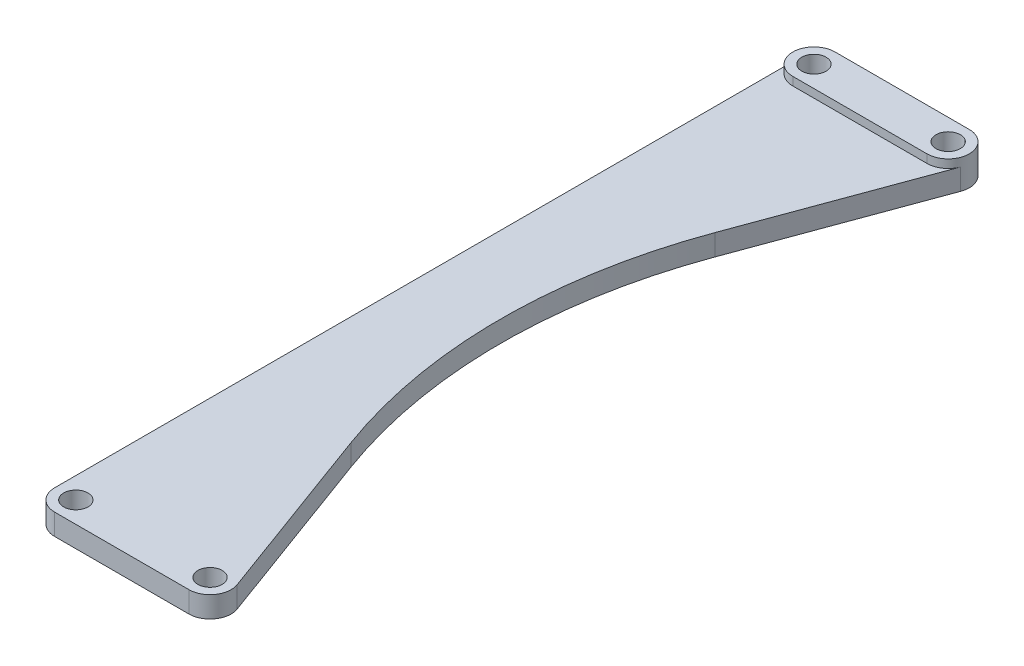
ISO-10303-21;
HEADER;
FILE_DESCRIPTION(('STEP AP214'),'2;1');
FILE_NAME('part.step','',(''),(''),'','','');
FILE_SCHEMA(('AUTOMOTIVE_DESIGN { 1 0 10303 214 1 1 1 1 }'));
ENDSEC;
DATA;
#1=APPLICATION_CONTEXT('core data for automotive mechanical design processes');
#2=APPLICATION_PROTOCOL_DEFINITION('international standard','automotive_design',2000,#1);
#3=PRODUCT_CONTEXT('',#1,'mechanical');
#4=PRODUCT('Part','Part','',(#3));
#5=PRODUCT_RELATED_PRODUCT_CATEGORY('part','',(#4));
#6=PRODUCT_DEFINITION_FORMATION('','',#4);
#7=PRODUCT_DEFINITION_CONTEXT('part definition',#1,'design');
#8=PRODUCT_DEFINITION('design','',#6,#7);
#9=PRODUCT_DEFINITION_SHAPE('','',#8);
#10=(LENGTH_UNIT() NAMED_UNIT(*) SI_UNIT(.MILLI.,.METRE.));
#11=(NAMED_UNIT(*) PLANE_ANGLE_UNIT() SI_UNIT($,.RADIAN.));
#12=(NAMED_UNIT(*) SI_UNIT($,.STERADIAN.) SOLID_ANGLE_UNIT());
#13=UNCERTAINTY_MEASURE_WITH_UNIT(LENGTH_MEASURE(1.E-05),#10,'distance_accuracy_value','');
#14=(GEOMETRIC_REPRESENTATION_CONTEXT(3) GLOBAL_UNCERTAINTY_ASSIGNED_CONTEXT((#13)) GLOBAL_UNIT_ASSIGNED_CONTEXT((#10,
#11,#12)) REPRESENTATION_CONTEXT('',''));
#15=CARTESIAN_POINT('',(0.,0.,0.));
#16=DIRECTION('',(0.,0.,1.));
#17=DIRECTION('',(1.,0.,0.));
#18=AXIS2_PLACEMENT_3D('',#15,#16,#17);
#19=CARTESIAN_POINT('',(25.4,4.,139.7));
#20=DIRECTION('',(0.,1.,0.));
#21=DIRECTION('',(0.,0.,1.));
#22=AXIS2_PLACEMENT_3D('',#19,#20,#21);
#23=PLANE('',#22);
#24=CARTESIAN_POINT('',(0.,4.,0.));
#25=DIRECTION('',(0.,1.,0.));
#26=DIRECTION('',(0.,0.,1.));
#27=AXIS2_PLACEMENT_3D('',#24,#25,#26);
#28=CIRCLE('',#27,4.);
#29=CARTESIAN_POINT('',(-4.00000000000002,4.,0.));
#30=VERTEX_POINT('',#29);
#31=CARTESIAN_POINT('',(0.,4.,4.));
#32=VERTEX_POINT('',#31);
#33=EDGE_CURVE('E11',#30,#32,#28,.T.);
#34=ORIENTED_EDGE('',*,*,#33,.F.);
#35=DIRECTION('',(0.,0.,1.));
#36=VECTOR('',#35,1.);
#37=CARTESIAN_POINT('',(-3.99999999999999,4.,143.7));
#38=LINE('',#37,#36);
#39=CARTESIAN_POINT('',(-3.99999999999999,4.,139.7));
#40=VERTEX_POINT('',#39);
#41=EDGE_CURVE('E196',#30,#40,#38,.T.);
#42=ORIENTED_EDGE('',*,*,#41,.T.);
#43=CARTESIAN_POINT('',(0.,4.,139.7));
#44=DIRECTION('',(0.,1.,0.));
#45=DIRECTION('',(0.,0.,1.));
#46=AXIS2_PLACEMENT_3D('',#43,#44,#45);
#47=CIRCLE('',#46,4.);
#48=CARTESIAN_POINT('',(0.,4.,143.7));
#49=VERTEX_POINT('',#48);
#50=EDGE_CURVE('E259',#40,#49,#47,.T.);
#51=ORIENTED_EDGE('',*,*,#50,.T.);
#52=DIRECTION('',(1.,0.,0.));
#53=VECTOR('',#52,1.);
#54=CARTESIAN_POINT('',(-3.99999999999999,4.,143.7));
#55=LINE('',#54,#53);
#56=CARTESIAN_POINT('',(25.4,4.,143.7));
#57=VERTEX_POINT('',#56);
#58=EDGE_CURVE('E200',#49,#57,#55,.T.);
#59=ORIENTED_EDGE('',*,*,#58,.T.);
#60=CARTESIAN_POINT('',(25.4,4.,139.7));
#61=DIRECTION('',(0.,1.,0.));
#62=DIRECTION('',(0.,0.,1.));
#63=AXIS2_PLACEMENT_3D('',#60,#61,#62);
#64=CIRCLE('',#63,4.00000000000001);
#65=CARTESIAN_POINT('',(29.154640594373,4.,138.320625501509));
#66=VERTEX_POINT('',#65);
#67=EDGE_CURVE('E203',#57,#66,#64,.T.);
#68=ORIENTED_EDGE('',*,*,#67,.T.);
#69=DIRECTION('',(-0.344843624622696,0.,-0.938660148593239));
#70=VECTOR('',#69,1.);
#71=CARTESIAN_POINT('',(4.00000000000001,4.,69.85));
#72=LINE('',#71,#70);
#73=CARTESIAN_POINT('',(16.6688158244642,4.,104.33436246227));
#74=VERTEX_POINT('',#73);
#75=EDGE_CURVE('E189',#66,#74,#72,.T.);
#76=ORIENTED_EDGE('',*,*,#75,.T.);
#77=CARTESIAN_POINT('',(110.534830683788,4.,69.85));
#78=DIRECTION('',(0.,1.,0.));
#79=DIRECTION('',(0.,0.,1.));
#80=AXIS2_PLACEMENT_3D('',#77,#78,#79);
#81=CIRCLE('',#80,100.);
#82=CARTESIAN_POINT('',(16.6688158244641,4.,35.3656375377304));
#83=VERTEX_POINT('',#82);
#84=EDGE_CURVE('E43',#74,#83,#81,.F.);
#85=ORIENTED_EDGE('',*,*,#84,.T.);
#86=DIRECTION('',(0.344843624622696,0.,-0.938660148593239));
#87=VECTOR('',#86,1.);
#88=CARTESIAN_POINT('',(4.00000000000001,4.,69.85));
#89=LINE('',#88,#87);
#90=CARTESIAN_POINT('',(29.154640594373,4.,1.37937449849078));
#91=VERTEX_POINT('',#90);
#92=EDGE_CURVE('E192',#83,#91,#89,.T.);
#93=ORIENTED_EDGE('',*,*,#92,.T.);
#94=CARTESIAN_POINT('',(25.4,4.,0.));
#95=DIRECTION('',(0.,1.,0.));
#96=DIRECTION('',(0.,0.,1.));
#97=AXIS2_PLACEMENT_3D('',#94,#95,#96);
#98=CIRCLE('',#97,4.);
#99=CARTESIAN_POINT('',(25.4,4.,4.));
#100=VERTEX_POINT('',#99);
#101=EDGE_CURVE('E154',#100,#91,#98,.T.);
#102=ORIENTED_EDGE('',*,*,#101,.F.);
#103=DIRECTION('',(1.,0.,0.));
#104=VECTOR('',#103,1.);
#105=CARTESIAN_POINT('',(0.,4.,4.));
#106=LINE('',#105,#104);
#107=EDGE_CURVE('E56',#32,#100,#106,.T.);
#108=ORIENTED_EDGE('',*,*,#107,.F.);
#109=EDGE_LOOP('',(#34,#42,#51,#59,#68,#76,#85,#93,#102,#108));
#110=FACE_BOUND('',#109,.T.);
#111=CARTESIAN_POINT('',(25.4,4.,139.7));
#112=DIRECTION('',(0.,1.,0.));
#113=DIRECTION('',(0.,0.,1.));
#114=AXIS2_PLACEMENT_3D('',#111,#112,#113);
#115=CIRCLE('',#114,2.3);
#116=CARTESIAN_POINT('',(25.4,4.,142.));
#117=VERTEX_POINT('',#116);
#118=EDGE_CURVE('E173',#117,#117,#115,.T.);
#119=ORIENTED_EDGE('',*,*,#118,.F.);
#120=EDGE_LOOP('',(#119));
#121=FACE_BOUND('',#120,.T.);
#122=CARTESIAN_POINT('',(0.,4.,139.7));
#123=DIRECTION('',(0.,1.,0.));
#124=DIRECTION('',(0.,0.,1.));
#125=AXIS2_PLACEMENT_3D('',#122,#123,#124);
#126=CIRCLE('',#125,2.30000000000137);
#127=CARTESIAN_POINT('',(0.,4.,142.000000000001));
#128=VERTEX_POINT('',#127);
#129=EDGE_CURVE('E164',#128,#128,#126,.T.);
#130=ORIENTED_EDGE('',*,*,#129,.F.);
#131=EDGE_LOOP('',(#130));
#132=FACE_BOUND('',#131,.T.);
#133=ADVANCED_FACE('F39',(#110,#121,#132),#23,.T.);
#134=CARTESIAN_POINT('',(25.4,0.,139.7));
#135=DIRECTION('',(0.,1.,0.));
#136=DIRECTION('',(0.,0.,1.));
#137=AXIS2_PLACEMENT_3D('',#134,#135,#136);
#138=PLANE('',#137);
#139=DIRECTION('',(0.,0.,1.));
#140=VECTOR('',#139,1.);
#141=CARTESIAN_POINT('',(-3.99999999999999,0.,143.7));
#142=LINE('',#141,#140);
#143=CARTESIAN_POINT('',(-4.00000000000002,0.,0.));
#144=VERTEX_POINT('',#143);
#145=CARTESIAN_POINT('',(-3.99999999999999,0.,139.7));
#146=VERTEX_POINT('',#145);
#147=EDGE_CURVE('E219',#144,#146,#142,.T.);
#148=ORIENTED_EDGE('',*,*,#147,.F.);
#149=CARTESIAN_POINT('',(0.,0.,0.));
#150=DIRECTION('',(0.,1.,0.));
#151=DIRECTION('',(0.,0.,1.));
#152=AXIS2_PLACEMENT_3D('',#149,#150,#151);
#153=CIRCLE('',#152,4.);
#154=CARTESIAN_POINT('',(0.,0.,-4.));
#155=VERTEX_POINT('',#154);
#156=EDGE_CURVE('E253',#144,#155,#153,.F.);
#157=ORIENTED_EDGE('',*,*,#156,.T.);
#158=DIRECTION('',(-1.,0.,0.));
#159=VECTOR('',#158,1.);
#160=CARTESIAN_POINT('',(-4.00000000000002,0.,-4.));
#161=LINE('',#160,#159);
#162=CARTESIAN_POINT('',(25.4,0.,-4.));
#163=VERTEX_POINT('',#162);
#164=EDGE_CURVE('E215',#163,#155,#161,.T.);
#165=ORIENTED_EDGE('',*,*,#164,.F.);
#166=CARTESIAN_POINT('',(25.4,0.,0.));
#167=DIRECTION('',(0.,1.,0.));
#168=DIRECTION('',(0.,0.,1.));
#169=AXIS2_PLACEMENT_3D('',#166,#167,#168);
#170=CIRCLE('',#169,4.);
#171=CARTESIAN_POINT('',(29.154640594373,0.,1.37937449849078));
#172=VERTEX_POINT('',#171);
#173=EDGE_CURVE('E212',#172,#163,#170,.T.);
#174=ORIENTED_EDGE('',*,*,#173,.F.);
#175=DIRECTION('',(0.344843624622696,0.,-0.938660148593239));
#176=VECTOR('',#175,1.);
#177=CARTESIAN_POINT('',(4.00000000000001,0.,69.85));
#178=LINE('',#177,#176);
#179=CARTESIAN_POINT('',(16.6688158244641,0.,35.3656375377304));
#180=VERTEX_POINT('',#179);
#181=EDGE_CURVE('E209',#180,#172,#178,.T.);
#182=ORIENTED_EDGE('',*,*,#181,.F.);
#183=CARTESIAN_POINT('',(110.534830683788,0.,69.85));
#184=DIRECTION('',(0.,1.,0.));
#185=DIRECTION('',(0.,0.,1.));
#186=AXIS2_PLACEMENT_3D('',#183,#184,#185);
#187=CIRCLE('',#186,100.);
#188=CARTESIAN_POINT('',(16.6688158244642,0.,104.33436246227));
#189=VERTEX_POINT('',#188);
#190=EDGE_CURVE('E271',#180,#189,#187,.T.);
#191=ORIENTED_EDGE('',*,*,#190,.T.);
#192=DIRECTION('',(-0.344843624622696,0.,-0.938660148593239));
#193=VECTOR('',#192,1.);
#194=CARTESIAN_POINT('',(4.00000000000001,0.,69.85));
#195=LINE('',#194,#193);
#196=CARTESIAN_POINT('',(29.154640594373,0.,138.320625501509));
#197=VERTEX_POINT('',#196);
#198=EDGE_CURVE('E188',#197,#189,#195,.T.);
#199=ORIENTED_EDGE('',*,*,#198,.F.);
#200=CARTESIAN_POINT('',(25.4,0.,139.7));
#201=DIRECTION('',(0.,1.,0.));
#202=DIRECTION('',(0.,0.,1.));
#203=AXIS2_PLACEMENT_3D('',#200,#201,#202);
#204=CIRCLE('',#203,4.00000000000001);
#205=CARTESIAN_POINT('',(25.4,0.,143.7));
#206=VERTEX_POINT('',#205);
#207=EDGE_CURVE('E193',#206,#197,#204,.T.);
#208=ORIENTED_EDGE('',*,*,#207,.F.);
#209=DIRECTION('',(1.,0.,0.));
#210=VECTOR('',#209,1.);
#211=CARTESIAN_POINT('',(-3.99999999999999,0.,143.7));
#212=LINE('',#211,#210);
#213=CARTESIAN_POINT('',(0.,0.,143.7));
#214=VERTEX_POINT('',#213);
#215=EDGE_CURVE('E223',#214,#206,#212,.T.);
#216=ORIENTED_EDGE('',*,*,#215,.F.);
#217=CARTESIAN_POINT('',(0.,0.,139.7));
#218=DIRECTION('',(0.,1.,0.));
#219=DIRECTION('',(0.,0.,1.));
#220=AXIS2_PLACEMENT_3D('',#217,#218,#219);
#221=CIRCLE('',#220,4.);
#222=EDGE_CURVE('E250',#214,#146,#221,.F.);
#223=ORIENTED_EDGE('',*,*,#222,.T.);
#224=EDGE_LOOP('',(#148,#157,#165,#174,#182,#191,#199,#208,#216,#223));
#225=FACE_BOUND('',#224,.T.);
#226=CARTESIAN_POINT('',(0.,0.,0.));
#227=DIRECTION('',(0.,1.,0.));
#228=DIRECTION('',(0.,0.,1.));
#229=AXIS2_PLACEMENT_3D('',#226,#227,#228);
#230=CIRCLE('',#229,2.3);
#231=CARTESIAN_POINT('',(0.,0.,2.3));
#232=VERTEX_POINT('',#231);
#233=EDGE_CURVE('E184',#232,#232,#230,.T.);
#234=ORIENTED_EDGE('',*,*,#233,.T.);
#235=EDGE_LOOP('',(#234));
#236=FACE_BOUND('',#235,.T.);
#237=CARTESIAN_POINT('',(25.4,0.,0.));
#238=DIRECTION('',(0.,1.,0.));
#239=DIRECTION('',(0.,0.,1.));
#240=AXIS2_PLACEMENT_3D('',#237,#238,#239);
#241=CIRCLE('',#240,2.3);
#242=CARTESIAN_POINT('',(25.4,0.,2.3));
#243=VERTEX_POINT('',#242);
#244=EDGE_CURVE('E177',#243,#243,#241,.T.);
#245=ORIENTED_EDGE('',*,*,#244,.T.);
#246=EDGE_LOOP('',(#245));
#247=FACE_BOUND('',#246,.T.);
#248=CARTESIAN_POINT('',(25.4,0.,139.7));
#249=DIRECTION('',(0.,1.,0.));
#250=DIRECTION('',(0.,0.,1.));
#251=AXIS2_PLACEMENT_3D('',#248,#249,#250);
#252=CIRCLE('',#251,2.3);
#253=CARTESIAN_POINT('',(25.4,0.,142.));
#254=VERTEX_POINT('',#253);
#255=EDGE_CURVE('E171',#254,#254,#252,.T.);
#256=ORIENTED_EDGE('',*,*,#255,.T.);
#257=EDGE_LOOP('',(#256));
#258=FACE_BOUND('',#257,.T.);
#259=CARTESIAN_POINT('',(0.,0.,139.7));
#260=DIRECTION('',(0.,1.,0.));
#261=DIRECTION('',(0.,0.,1.));
#262=AXIS2_PLACEMENT_3D('',#259,#260,#261);
#263=CIRCLE('',#262,2.30000000000137);
#264=CARTESIAN_POINT('',(0.,0.,142.000000000001));
#265=VERTEX_POINT('',#264);
#266=EDGE_CURVE('E159',#265,#265,#263,.T.);
#267=ORIENTED_EDGE('',*,*,#266,.T.);
#268=EDGE_LOOP('',(#267));
#269=FACE_BOUND('',#268,.T.);
#270=ADVANCED_FACE('F296',(#225,#236,#247,#258,#269),#138,.F.);
#271=CARTESIAN_POINT('',(4.00000000000001,4.,69.85));
#272=DIRECTION('',(-0.938660148593239,0.,0.344843624622696));
#273=DIRECTION('',(0.344843624622696,0.,0.938660148593239));
#274=AXIS2_PLACEMENT_3D('',#271,#272,#273);
#275=PLANE('',#274);
#276=ORIENTED_EDGE('',*,*,#198,.T.);
#277=DIRECTION('',(0.,-1.,0.));
#278=VECTOR('',#277,1.);
#279=CARTESIAN_POINT('',(16.6688158244642,4.,104.33436246227));
#280=LINE('',#279,#278);
#281=EDGE_CURVE('E63',#189,#74,#280,.F.);
#282=ORIENTED_EDGE('',*,*,#281,.T.);
#283=ORIENTED_EDGE('',*,*,#75,.F.);
#284=DIRECTION('',(0.,-1.,0.));
#285=VECTOR('',#284,1.);
#286=CARTESIAN_POINT('',(29.154640594373,4.,138.320625501509));
#287=LINE('',#286,#285);
#288=EDGE_CURVE('E206',#66,#197,#287,.T.);
#289=ORIENTED_EDGE('',*,*,#288,.T.);
#290=EDGE_LOOP('',(#276,#282,#283,#289));
#291=FACE_BOUND('',#290,.T.);
#292=ADVANCED_FACE('F302',(#291),#275,.F.);
#293=CARTESIAN_POINT('',(4.00000000000001,4.,69.85));
#294=DIRECTION('',(-0.938660148593239,0.,-0.344843624622696));
#295=DIRECTION('',(-0.344843624622696,0.,0.938660148593239));
#296=AXIS2_PLACEMENT_3D('',#293,#294,#295);
#297=PLANE('',#296);
#298=ORIENTED_EDGE('',*,*,#92,.F.);
#299=DIRECTION('',(0.,-1.,0.));
#300=VECTOR('',#299,1.);
#301=CARTESIAN_POINT('',(16.6688158244641,0.,35.3656375377304));
#302=LINE('',#301,#300);
#303=EDGE_CURVE('E266',#83,#180,#302,.T.);
#304=ORIENTED_EDGE('',*,*,#303,.T.);
#305=ORIENTED_EDGE('',*,*,#181,.T.);
#306=DIRECTION('',(0.,-1.,0.));
#307=VECTOR('',#306,1.);
#308=CARTESIAN_POINT('',(29.154640594373,4.,1.37937449849078));
#309=LINE('',#308,#307);
#310=EDGE_CURVE('E239',#91,#172,#309,.T.);
#311=ORIENTED_EDGE('',*,*,#310,.F.);
#312=EDGE_LOOP('',(#298,#304,#305,#311));
#313=FACE_BOUND('',#312,.T.);
#314=ADVANCED_FACE('F284',(#313),#297,.F.);
#315=CARTESIAN_POINT('',(25.4,4.,0.));
#316=DIRECTION('',(0.,-1.,0.));
#317=DIRECTION('',(0.,0.,-1.));
#318=AXIS2_PLACEMENT_3D('',#315,#316,#317);
#319=CYLINDRICAL_SURFACE('',#318,4.);
#320=ORIENTED_EDGE('',*,*,#173,.T.);
#321=DIRECTION('',(0.,-1.,0.));
#322=VECTOR('',#321,1.);
#323=CARTESIAN_POINT('',(25.4,4.,-4.));
#324=LINE('',#323,#322);
#325=CARTESIAN_POINT('',(25.4,5.575308,-4.));
#326=VERTEX_POINT('',#325);
#327=EDGE_CURVE('E235',#326,#163,#324,.T.);
#328=ORIENTED_EDGE('',*,*,#327,.F.);
#329=CARTESIAN_POINT('',(25.4,5.575308,0.));
#330=DIRECTION('',(0.,1.,0.));
#331=DIRECTION('',(0.,0.,1.));
#332=AXIS2_PLACEMENT_3D('',#329,#330,#331);
#333=CIRCLE('',#332,4.);
#334=CARTESIAN_POINT('',(25.4,5.575308,4.));
#335=VERTEX_POINT('',#334);
#336=EDGE_CURVE('E142',#335,#326,#333,.T.);
#337=ORIENTED_EDGE('',*,*,#336,.F.);
#338=DIRECTION('',(0.,-1.,0.));
#339=VECTOR('',#338,1.);
#340=CARTESIAN_POINT('',(25.4,5.575308,4.));
#341=LINE('',#340,#339);
#342=EDGE_CURVE('E137',#335,#100,#341,.T.);
#343=ORIENTED_EDGE('',*,*,#342,.T.);
#344=ORIENTED_EDGE('',*,*,#101,.T.);
#345=ORIENTED_EDGE('',*,*,#310,.T.);
#346=EDGE_LOOP('',(#320,#328,#337,#343,#344,#345));
#347=FACE_BOUND('',#346,.T.);
#348=ADVANCED_FACE('F323',(#347),#319,.T.);
#349=CARTESIAN_POINT('',(-4.00000000000002,4.,-4.));
#350=DIRECTION('',(0.,0.,1.));
#351=DIRECTION('',(1.,0.,0.));
#352=AXIS2_PLACEMENT_3D('',#349,#350,#351);
#353=PLANE('',#352);
#354=ORIENTED_EDGE('',*,*,#164,.T.);
#355=DIRECTION('',(0.,-1.,0.));
#356=VECTOR('',#355,1.);
#357=CARTESIAN_POINT('',(0.,4.,-4.));
#358=LINE('',#357,#356);
#359=CARTESIAN_POINT('',(0.,5.575308,-4.));
#360=VERTEX_POINT('',#359);
#361=EDGE_CURVE('E256',#155,#360,#358,.F.);
#362=ORIENTED_EDGE('',*,*,#361,.T.);
#363=DIRECTION('',(-1.,0.,0.));
#364=VECTOR('',#363,1.);
#365=CARTESIAN_POINT('',(0.,5.575308,-4.));
#366=LINE('',#365,#364);
#367=EDGE_CURVE('E150',#326,#360,#366,.T.);
#368=ORIENTED_EDGE('',*,*,#367,.F.);
#369=ORIENTED_EDGE('',*,*,#327,.T.);
#370=EDGE_LOOP('',(#354,#362,#368,#369));
#371=FACE_BOUND('',#370,.T.);
#372=ADVANCED_FACE('F319',(#371),#353,.F.);
#373=CARTESIAN_POINT('',(-3.99999999999999,4.,143.7));
#374=DIRECTION('',(1.,0.,0.));
#375=DIRECTION('',(0.,0.,-1.));
#376=AXIS2_PLACEMENT_3D('',#373,#374,#375);
#377=PLANE('',#376);
#378=ORIENTED_EDGE('',*,*,#41,.F.);
#379=DIRECTION('',(0.,-1.,0.));
#380=VECTOR('',#379,1.);
#381=CARTESIAN_POINT('',(-4.00000000000002,4.,0.));
#382=LINE('',#381,#380);
#383=EDGE_CURVE('E246',#30,#144,#382,.T.);
#384=ORIENTED_EDGE('',*,*,#383,.T.);
#385=ORIENTED_EDGE('',*,*,#147,.T.);
#386=DIRECTION('',(0.,-1.,0.));
#387=VECTOR('',#386,1.);
#388=CARTESIAN_POINT('',(-3.99999999999999,4.,139.7));
#389=LINE('',#388,#387);
#390=EDGE_CURVE('E243',#146,#40,#389,.F.);
#391=ORIENTED_EDGE('',*,*,#390,.T.);
#392=EDGE_LOOP('',(#378,#384,#385,#391));
#393=FACE_BOUND('',#392,.T.);
#394=ADVANCED_FACE('F315',(#393),#377,.F.);
#395=CARTESIAN_POINT('',(-3.99999999999999,4.,143.7));
#396=DIRECTION('',(0.,0.,-1.));
#397=DIRECTION('',(-1.,0.,0.));
#398=AXIS2_PLACEMENT_3D('',#395,#396,#397);
#399=PLANE('',#398);
#400=ORIENTED_EDGE('',*,*,#58,.F.);
#401=DIRECTION('',(0.,-1.,0.));
#402=VECTOR('',#401,1.);
#403=CARTESIAN_POINT('',(0.,4.,143.7));
#404=LINE('',#403,#402);
#405=EDGE_CURVE('E262',#49,#214,#404,.T.);
#406=ORIENTED_EDGE('',*,*,#405,.T.);
#407=ORIENTED_EDGE('',*,*,#215,.T.);
#408=DIRECTION('',(0.,-1.,0.));
#409=VECTOR('',#408,1.);
#410=CARTESIAN_POINT('',(25.4,4.,143.7));
#411=LINE('',#410,#409);
#412=EDGE_CURVE('E231',#57,#206,#411,.T.);
#413=ORIENTED_EDGE('',*,*,#412,.F.);
#414=EDGE_LOOP('',(#400,#406,#407,#413));
#415=FACE_BOUND('',#414,.T.);
#416=ADVANCED_FACE('F311',(#415),#399,.F.);
#417=CARTESIAN_POINT('',(25.4,4.,139.7));
#418=DIRECTION('',(0.,-1.,0.));
#419=DIRECTION('',(0.,0.,-1.));
#420=AXIS2_PLACEMENT_3D('',#417,#418,#419);
#421=CYLINDRICAL_SURFACE('',#420,4.00000000000001);
#422=ORIENTED_EDGE('',*,*,#207,.T.);
#423=ORIENTED_EDGE('',*,*,#288,.F.);
#424=ORIENTED_EDGE('',*,*,#67,.F.);
#425=ORIENTED_EDGE('',*,*,#412,.T.);
#426=EDGE_LOOP('',(#422,#423,#424,#425));
#427=FACE_BOUND('',#426,.T.);
#428=ADVANCED_FACE('F308',(#427),#421,.T.);
#429=CARTESIAN_POINT('',(0.,4.,0.));
#430=DIRECTION('',(0.,-1.,0.));
#431=DIRECTION('',(0.,0.,-1.));
#432=AXIS2_PLACEMENT_3D('',#429,#430,#431);
#433=CYLINDRICAL_SURFACE('',#432,2.3);
#434=ORIENTED_EDGE('',*,*,#233,.F.);
#435=EDGE_LOOP('',(#434));
#436=FACE_BOUND('',#435,.T.);
#437=CARTESIAN_POINT('',(0.,5.575308,0.));
#438=DIRECTION('',(0.,1.,0.));
#439=DIRECTION('',(0.,0.,1.));
#440=AXIS2_PLACEMENT_3D('',#437,#438,#439);
#441=CIRCLE('',#440,2.3);
#442=CARTESIAN_POINT('',(0.,5.575308,2.3));
#443=VERTEX_POINT('',#442);
#444=EDGE_CURVE('E359',#443,#443,#441,.T.);
#445=ORIENTED_EDGE('',*,*,#444,.T.);
#446=EDGE_LOOP('',(#445));
#447=FACE_BOUND('',#446,.T.);
#448=ADVANCED_FACE('F305',(#436,#447),#433,.F.);
#449=CARTESIAN_POINT('',(25.4,4.,0.));
#450=DIRECTION('',(0.,-1.,0.));
#451=DIRECTION('',(0.,0.,-1.));
#452=AXIS2_PLACEMENT_3D('',#449,#450,#451);
#453=CYLINDRICAL_SURFACE('',#452,2.3);
#454=ORIENTED_EDGE('',*,*,#244,.F.);
#455=EDGE_LOOP('',(#454));
#456=FACE_BOUND('',#455,.T.);
#457=CARTESIAN_POINT('',(25.4,5.575308,0.));
#458=DIRECTION('',(0.,1.,0.));
#459=DIRECTION('',(0.,0.,1.));
#460=AXIS2_PLACEMENT_3D('',#457,#458,#459);
#461=CIRCLE('',#460,2.3);
#462=CARTESIAN_POINT('',(25.4,5.575308,2.3));
#463=VERTEX_POINT('',#462);
#464=EDGE_CURVE('E357',#463,#463,#461,.T.);
#465=ORIENTED_EDGE('',*,*,#464,.T.);
#466=EDGE_LOOP('',(#465));
#467=FACE_BOUND('',#466,.T.);
#468=ADVANCED_FACE('F343',(#456,#467),#453,.F.);
#469=CARTESIAN_POINT('',(25.4,4.,139.7));
#470=DIRECTION('',(0.,-1.,0.));
#471=DIRECTION('',(0.,0.,-1.));
#472=AXIS2_PLACEMENT_3D('',#469,#470,#471);
#473=CYLINDRICAL_SURFACE('',#472,2.3);
#474=ORIENTED_EDGE('',*,*,#118,.T.);
#475=EDGE_LOOP('',(#474));
#476=FACE_BOUND('',#475,.T.);
#477=ORIENTED_EDGE('',*,*,#255,.F.);
#478=EDGE_LOOP('',(#477));
#479=FACE_BOUND('',#478,.T.);
#480=ADVANCED_FACE('F337',(#476,#479),#473,.F.);
#481=CARTESIAN_POINT('',(0.,4.,139.7));
#482=DIRECTION('',(0.,-1.,0.));
#483=DIRECTION('',(0.,0.,-1.));
#484=AXIS2_PLACEMENT_3D('',#481,#482,#483);
#485=CYLINDRICAL_SURFACE('',#484,2.30000000000137);
#486=ORIENTED_EDGE('',*,*,#129,.T.);
#487=EDGE_LOOP('',(#486));
#488=FACE_BOUND('',#487,.T.);
#489=ORIENTED_EDGE('',*,*,#266,.F.);
#490=EDGE_LOOP('',(#489));
#491=FACE_BOUND('',#490,.T.);
#492=ADVANCED_FACE('F332',(#488,#491),#485,.F.);
#493=CARTESIAN_POINT('',(0.,4.,0.));
#494=DIRECTION('',(0.,-1.,0.));
#495=DIRECTION('',(0.,0.,-1.));
#496=AXIS2_PLACEMENT_3D('',#493,#494,#495);
#497=CYLINDRICAL_SURFACE('',#496,4.);
#498=ORIENTED_EDGE('',*,*,#383,.F.);
#499=ORIENTED_EDGE('',*,*,#33,.T.);
#500=DIRECTION('',(0.,-1.,0.));
#501=VECTOR('',#500,1.);
#502=CARTESIAN_POINT('',(0.,5.575308,4.));
#503=LINE('',#502,#501);
#504=CARTESIAN_POINT('',(0.,5.575308,4.));
#505=VERTEX_POINT('',#504);
#506=EDGE_CURVE('E135',#505,#32,#503,.T.);
#507=ORIENTED_EDGE('',*,*,#506,.F.);
#508=CARTESIAN_POINT('',(0.,5.575308,0.));
#509=DIRECTION('',(0.,1.,0.));
#510=DIRECTION('',(0.,0.,1.));
#511=AXIS2_PLACEMENT_3D('',#508,#509,#510);
#512=CIRCLE('',#511,4.);
#513=EDGE_CURVE('E143',#360,#505,#512,.T.);
#514=ORIENTED_EDGE('',*,*,#513,.F.);
#515=ORIENTED_EDGE('',*,*,#361,.F.);
#516=ORIENTED_EDGE('',*,*,#156,.F.);
#517=EDGE_LOOP('',(#498,#499,#507,#514,#515,#516));
#518=FACE_BOUND('',#517,.T.);
#519=ADVANCED_FACE('F157',(#518),#497,.T.);
#520=CARTESIAN_POINT('',(0.,4.,139.7));
#521=DIRECTION('',(0.,-1.,0.));
#522=DIRECTION('',(0.,0.,-1.));
#523=AXIS2_PLACEMENT_3D('',#520,#521,#522);
#524=CYLINDRICAL_SURFACE('',#523,4.);
#525=ORIENTED_EDGE('',*,*,#50,.F.);
#526=ORIENTED_EDGE('',*,*,#390,.F.);
#527=ORIENTED_EDGE('',*,*,#222,.F.);
#528=ORIENTED_EDGE('',*,*,#405,.F.);
#529=EDGE_LOOP('',(#525,#526,#527,#528));
#530=FACE_BOUND('',#529,.T.);
#531=ADVANCED_FACE('F287',(#530),#524,.T.);
#532=CARTESIAN_POINT('',(110.534830683788,4.,69.85));
#533=DIRECTION('',(0.,1.,0.));
#534=DIRECTION('',(0.,0.,1.));
#535=AXIS2_PLACEMENT_3D('',#532,#533,#534);
#536=CYLINDRICAL_SURFACE('',#535,100.);
#537=ORIENTED_EDGE('',*,*,#84,.F.);
#538=ORIENTED_EDGE('',*,*,#281,.F.);
#539=ORIENTED_EDGE('',*,*,#190,.F.);
#540=ORIENTED_EDGE('',*,*,#303,.F.);
#541=EDGE_LOOP('',(#537,#538,#539,#540));
#542=FACE_BOUND('',#541,.T.);
#543=ADVANCED_FACE('F41',(#542),#536,.F.);
#544=CARTESIAN_POINT('',(0.,5.575308,0.));
#545=DIRECTION('',(0.,1.,0.));
#546=DIRECTION('',(0.,0.,1.));
#547=AXIS2_PLACEMENT_3D('',#544,#545,#546);
#548=PLANE('',#547);
#549=ORIENTED_EDGE('',*,*,#444,.F.);
#550=EDGE_LOOP('',(#549));
#551=FACE_BOUND('',#550,.T.);
#552=ORIENTED_EDGE('',*,*,#513,.T.);
#553=DIRECTION('',(1.,0.,0.));
#554=VECTOR('',#553,1.);
#555=CARTESIAN_POINT('',(0.,5.575308,4.));
#556=LINE('',#555,#554);
#557=EDGE_CURVE('E131',#505,#335,#556,.T.);
#558=ORIENTED_EDGE('',*,*,#557,.T.);
#559=ORIENTED_EDGE('',*,*,#336,.T.);
#560=ORIENTED_EDGE('',*,*,#367,.T.);
#561=EDGE_LOOP('',(#552,#558,#559,#560));
#562=FACE_BOUND('',#561,.T.);
#563=ORIENTED_EDGE('',*,*,#464,.F.);
#564=EDGE_LOOP('',(#563));
#565=FACE_BOUND('',#564,.T.);
#566=ADVANCED_FACE('F147',(#551,#562,#565),#548,.T.);
#567=CARTESIAN_POINT('',(0.,5.575308,4.));
#568=DIRECTION('',(0.,0.,-1.));
#569=DIRECTION('',(-1.,0.,0.));
#570=AXIS2_PLACEMENT_3D('',#567,#568,#569);
#571=PLANE('',#570);
#572=ORIENTED_EDGE('',*,*,#107,.T.);
#573=ORIENTED_EDGE('',*,*,#342,.F.);
#574=ORIENTED_EDGE('',*,*,#557,.F.);
#575=ORIENTED_EDGE('',*,*,#506,.T.);
#576=EDGE_LOOP('',(#572,#573,#574,#575));
#577=FACE_BOUND('',#576,.T.);
#578=ADVANCED_FACE('F133',(#577),#571,.F.);
#579=CLOSED_SHELL('',(#133,#270,#292,#314,#348,#372,#394,#416,#428,#448,#468,#480,#492,#519,
#531,#543,#566,#578));
#580=MANIFOLD_SOLID_BREP('B2',#579);
#581=ADVANCED_BREP_SHAPE_REPRESENTATION('',(#18,#580),#14);
#582=SHAPE_DEFINITION_REPRESENTATION(#9,#581);
ENDSEC;
END-ISO-10303-21;
